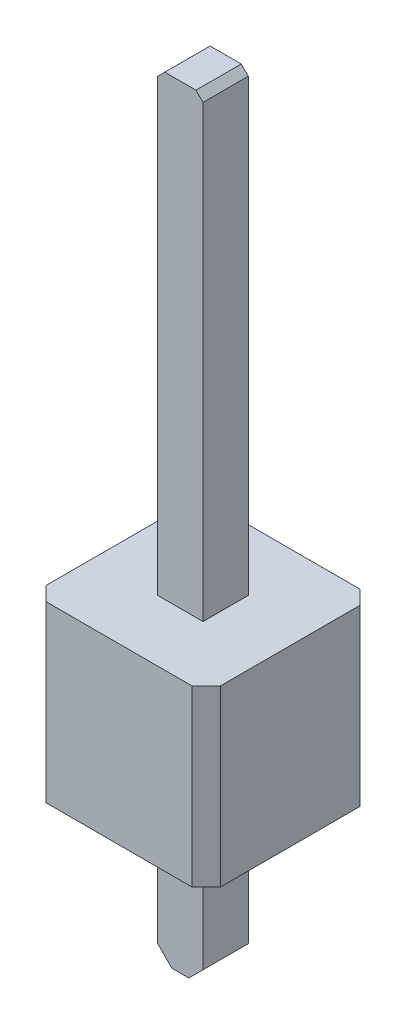
ISO-10303-21;
HEADER;
FILE_DESCRIPTION(('STEP AP214'),'2;1');
FILE_NAME('part.step','',(''),(''),'','','');
FILE_SCHEMA(('AUTOMOTIVE_DESIGN { 1 0 10303 214 1 1 1 1 }'));
ENDSEC;
DATA;
#1=APPLICATION_CONTEXT('core data for automotive mechanical design processes');
#2=APPLICATION_PROTOCOL_DEFINITION('international standard','automotive_design',2000,#1);
#3=PRODUCT_CONTEXT('',#1,'mechanical');
#4=PRODUCT('Part','Part','',(#3));
#5=PRODUCT_RELATED_PRODUCT_CATEGORY('part','',(#4));
#6=PRODUCT_DEFINITION_FORMATION('','',#4);
#7=PRODUCT_DEFINITION_CONTEXT('part definition',#1,'design');
#8=PRODUCT_DEFINITION('design','',#6,#7);
#9=PRODUCT_DEFINITION_SHAPE('','',#8);
#10=(LENGTH_UNIT() NAMED_UNIT(*) SI_UNIT(.MILLI.,.METRE.));
#11=(NAMED_UNIT(*) PLANE_ANGLE_UNIT() SI_UNIT($,.RADIAN.));
#12=(NAMED_UNIT(*) SI_UNIT($,.STERADIAN.) SOLID_ANGLE_UNIT());
#13=UNCERTAINTY_MEASURE_WITH_UNIT(LENGTH_MEASURE(1.E-05),#10,'distance_accuracy_value','');
#14=(GEOMETRIC_REPRESENTATION_CONTEXT(3) GLOBAL_UNCERTAINTY_ASSIGNED_CONTEXT((#13)) GLOBAL_UNIT_ASSIGNED_CONTEXT((#10,
#11,#12)) REPRESENTATION_CONTEXT('',''));
#15=CARTESIAN_POINT('',(0.,0.,0.));
#16=DIRECTION('',(0.,0.,1.));
#17=DIRECTION('',(1.,0.,0.));
#18=AXIS2_PLACEMENT_3D('',#15,#16,#17);
#19=CARTESIAN_POINT('',(-34.7731073021486,-32.8044362792521,2.37));
#20=DIRECTION('',(0.,1.,0.));
#21=DIRECTION('',(0.,0.,1.));
#22=AXIS2_PLACEMENT_3D('',#19,#20,#21);
#23=PLANE('',#22);
#24=DIRECTION('',(0.,0.,-1.));
#25=VECTOR('',#24,1.);
#26=CARTESIAN_POINT('',(-37.2331073021486,-32.8044362792521,2.37));
#27=LINE('',#26,#25);
#28=CARTESIAN_POINT('',(-37.2331073021486,-32.8044362792521,2.17));
#29=VERTEX_POINT('',#28);
#30=CARTESIAN_POINT('',(-37.2331073021486,-32.8044362792521,0.199999999999997));
#31=VERTEX_POINT('',#30);
#32=EDGE_CURVE('E242',#29,#31,#27,.T.);
#33=ORIENTED_EDGE('',*,*,#32,.T.);
#34=DIRECTION('',(-0.707106781186551,0.,0.707106781186544));
#35=VECTOR('',#34,1.);
#36=CARTESIAN_POINT('',(-37.2331073021486,-32.8044362792521,0.199999999999997));
#37=LINE('',#36,#35);
#38=CARTESIAN_POINT('',(-37.0331073021486,-32.8044362792521,0.));
#39=VERTEX_POINT('',#38);
#40=EDGE_CURVE('E277',#31,#39,#37,.F.);
#41=ORIENTED_EDGE('',*,*,#40,.T.);
#42=DIRECTION('',(1.,0.,0.));
#43=VECTOR('',#42,1.);
#44=CARTESIAN_POINT('',(-34.7731073021486,-32.8044362792521,0.));
#45=LINE('',#44,#43);
#46=CARTESIAN_POINT('',(-34.9731073021486,-32.8044362792521,0.));
#47=VERTEX_POINT('',#46);
#48=EDGE_CURVE('E223',#39,#47,#45,.T.);
#49=ORIENTED_EDGE('',*,*,#48,.T.);
#50=DIRECTION('',(-0.707106781186551,0.,-0.707106781186544));
#51=VECTOR('',#50,1.);
#52=CARTESIAN_POINT('',(-34.7731073021486,-32.8044362792521,0.199999999999997));
#53=LINE('',#52,#51);
#54=CARTESIAN_POINT('',(-34.7731073021486,-32.8044362792521,0.199999999999997));
#55=VERTEX_POINT('',#54);
#56=EDGE_CURVE('E272',#47,#55,#53,.F.);
#57=ORIENTED_EDGE('',*,*,#56,.T.);
#58=DIRECTION('',(0.,0.,-1.));
#59=VECTOR('',#58,1.);
#60=CARTESIAN_POINT('',(-34.7731073021486,-32.8044362792521,2.37));
#61=LINE('',#60,#59);
#62=CARTESIAN_POINT('',(-34.7731073021486,-32.8044362792521,2.17));
#63=VERTEX_POINT('',#62);
#64=EDGE_CURVE('E239',#63,#55,#61,.T.);
#65=ORIENTED_EDGE('',*,*,#64,.F.);
#66=DIRECTION('',(-0.707106781186544,0.,0.707106781186551));
#67=VECTOR('',#66,1.);
#68=CARTESIAN_POINT('',(-34.9731073021486,-32.8044362792521,2.37));
#69=LINE('',#68,#67);
#70=CARTESIAN_POINT('',(-34.9731073021486,-32.8044362792521,2.37));
#71=VERTEX_POINT('',#70);
#72=EDGE_CURVE('E262',#63,#71,#69,.T.);
#73=ORIENTED_EDGE('',*,*,#72,.T.);
#74=DIRECTION('',(1.,0.,0.));
#75=VECTOR('',#74,1.);
#76=CARTESIAN_POINT('',(-34.7731073021486,-32.8044362792521,2.37));
#77=LINE('',#76,#75);
#78=CARTESIAN_POINT('',(-37.0331073021486,-32.8044362792521,2.37));
#79=VERTEX_POINT('',#78);
#80=EDGE_CURVE('E224',#79,#71,#77,.T.);
#81=ORIENTED_EDGE('',*,*,#80,.F.);
#82=DIRECTION('',(-0.707106781186544,0.,-0.707106781186551));
#83=VECTOR('',#82,1.);
#84=CARTESIAN_POINT('',(-37.0331073021486,-32.8044362792521,2.37));
#85=LINE('',#84,#83);
#86=EDGE_CURVE('E248',#79,#29,#85,.T.);
#87=ORIENTED_EDGE('',*,*,#86,.T.);
#88=EDGE_LOOP('',(#33,#41,#49,#57,#65,#73,#81,#87));
#89=FACE_BOUND('',#88,.T.);
#90=DIRECTION('',(0.,0.,-1.));
#91=VECTOR('',#90,1.);
#92=CARTESIAN_POINT('',(-36.3231073021486,-32.8044362792521,1.505));
#93=LINE('',#92,#91);
#94=CARTESIAN_POINT('',(-36.3231073021486,-32.8044362792521,1.505));
#95=VERTEX_POINT('',#94);
#96=CARTESIAN_POINT('',(-36.3231073021486,-32.8044362792521,0.865000000000004));
#97=VERTEX_POINT('',#96);
#98=EDGE_CURVE('E168',#95,#97,#93,.T.);
#99=ORIENTED_EDGE('',*,*,#98,.F.);
#100=DIRECTION('',(-1.,0.,0.));
#101=VECTOR('',#100,1.);
#102=CARTESIAN_POINT('',(-35.6831073021486,-32.8044362792521,1.505));
#103=LINE('',#102,#101);
#104=CARTESIAN_POINT('',(-35.6831073021486,-32.8044362792521,1.505));
#105=VERTEX_POINT('',#104);
#106=EDGE_CURVE('E179',#105,#95,#103,.T.);
#107=ORIENTED_EDGE('',*,*,#106,.F.);
#108=DIRECTION('',(0.,0.,1.));
#109=VECTOR('',#108,1.);
#110=CARTESIAN_POINT('',(-35.6831073021486,-32.8044362792521,1.505));
#111=LINE('',#110,#109);
#112=CARTESIAN_POINT('',(-35.6831073021486,-32.8044362792521,0.865000000000004));
#113=VERTEX_POINT('',#112);
#114=EDGE_CURVE('E187',#113,#105,#111,.T.);
#115=ORIENTED_EDGE('',*,*,#114,.F.);
#116=DIRECTION('',(1.,0.,0.));
#117=VECTOR('',#116,1.);
#118=CARTESIAN_POINT('',(-35.6831073021486,-32.8044362792521,0.865000000000004));
#119=LINE('',#118,#117);
#120=EDGE_CURVE('E182',#97,#113,#119,.T.);
#121=ORIENTED_EDGE('',*,*,#120,.F.);
#122=EDGE_LOOP('',(#99,#107,#115,#121));
#123=FACE_BOUND('',#122,.T.);
#124=ADVANCED_FACE('F32',(#89,#123),#23,.F.);
#125=CARTESIAN_POINT('',(-34.7731073021486,-30.3444362792521,2.37));
#126=DIRECTION('',(0.,-1.,0.));
#127=DIRECTION('',(0.,0.,-1.));
#128=AXIS2_PLACEMENT_3D('',#125,#126,#127);
#129=PLANE('',#128);
#130=DIRECTION('',(-1.,0.,0.));
#131=VECTOR('',#130,1.);
#132=CARTESIAN_POINT('',(-34.7731073021486,-30.3444362792521,0.));
#133=LINE('',#132,#131);
#134=CARTESIAN_POINT('',(-34.9731073021486,-30.3444362792521,0.));
#135=VERTEX_POINT('',#134);
#136=CARTESIAN_POINT('',(-37.0331073021486,-30.3444362792521,0.));
#137=VERTEX_POINT('',#136);
#138=EDGE_CURVE('E228',#135,#137,#133,.T.);
#139=ORIENTED_EDGE('',*,*,#138,.T.);
#140=DIRECTION('',(0.707106781186551,0.,-0.707106781186544));
#141=VECTOR('',#140,1.);
#142=CARTESIAN_POINT('',(-37.2331073021486,-30.3444362792521,0.199999999999997));
#143=LINE('',#142,#141);
#144=CARTESIAN_POINT('',(-37.2331073021486,-30.3444362792521,0.199999999999997));
#145=VERTEX_POINT('',#144);
#146=EDGE_CURVE('E281',#137,#145,#143,.F.);
#147=ORIENTED_EDGE('',*,*,#146,.T.);
#148=DIRECTION('',(0.,0.,-1.));
#149=VECTOR('',#148,1.);
#150=CARTESIAN_POINT('',(-37.2331073021486,-30.3444362792521,2.37));
#151=LINE('',#150,#149);
#152=CARTESIAN_POINT('',(-37.2331073021486,-30.3444362792521,2.17));
#153=VERTEX_POINT('',#152);
#154=EDGE_CURVE('E230',#153,#145,#151,.T.);
#155=ORIENTED_EDGE('',*,*,#154,.F.);
#156=DIRECTION('',(0.707106781186544,0.,0.707106781186551));
#157=VECTOR('',#156,1.);
#158=CARTESIAN_POINT('',(-37.0331073021486,-30.3444362792521,2.37));
#159=LINE('',#158,#157);
#160=CARTESIAN_POINT('',(-37.0331073021486,-30.3444362792521,2.37));
#161=VERTEX_POINT('',#160);
#162=EDGE_CURVE('E252',#153,#161,#159,.T.);
#163=ORIENTED_EDGE('',*,*,#162,.T.);
#164=DIRECTION('',(-1.,0.,0.));
#165=VECTOR('',#164,1.);
#166=CARTESIAN_POINT('',(-34.7731073021486,-30.3444362792521,2.37));
#167=LINE('',#166,#165);
#168=CARTESIAN_POINT('',(-34.9731073021486,-30.3444362792521,2.37));
#169=VERTEX_POINT('',#168);
#170=EDGE_CURVE('E227',#169,#161,#167,.T.);
#171=ORIENTED_EDGE('',*,*,#170,.F.);
#172=DIRECTION('',(0.707106781186544,0.,-0.707106781186551));
#173=VECTOR('',#172,1.);
#174=CARTESIAN_POINT('',(-34.9731073021486,-30.3444362792521,2.37));
#175=LINE('',#174,#173);
#176=CARTESIAN_POINT('',(-34.7731073021486,-30.3444362792521,2.17));
#177=VERTEX_POINT('',#176);
#178=EDGE_CURVE('E258',#169,#177,#175,.T.);
#179=ORIENTED_EDGE('',*,*,#178,.T.);
#180=DIRECTION('',(0.,0.,-1.));
#181=VECTOR('',#180,1.);
#182=CARTESIAN_POINT('',(-34.7731073021486,-30.3444362792521,2.37));
#183=LINE('',#182,#181);
#184=CARTESIAN_POINT('',(-34.7731073021486,-30.3444362792521,0.199999999999997));
#185=VERTEX_POINT('',#184);
#186=EDGE_CURVE('E236',#177,#185,#183,.T.);
#187=ORIENTED_EDGE('',*,*,#186,.T.);
#188=DIRECTION('',(0.707106781186551,0.,0.707106781186544));
#189=VECTOR('',#188,1.);
#190=CARTESIAN_POINT('',(-34.7731073021486,-30.3444362792521,0.199999999999997));
#191=LINE('',#190,#189);
#192=EDGE_CURVE('E267',#185,#135,#191,.F.);
#193=ORIENTED_EDGE('',*,*,#192,.T.);
#194=EDGE_LOOP('',(#139,#147,#155,#163,#171,#179,#187,#193));
#195=FACE_BOUND('',#194,.T.);
#196=DIRECTION('',(0.,0.,1.));
#197=VECTOR('',#196,1.);
#198=CARTESIAN_POINT('',(-36.3231073021486,-30.3444362792521,1.505));
#199=LINE('',#198,#197);
#200=CARTESIAN_POINT('',(-36.3231073021486,-30.3444362792521,0.864999999999999));
#201=VERTEX_POINT('',#200);
#202=CARTESIAN_POINT('',(-36.3231073021486,-30.3444362792521,1.505));
#203=VERTEX_POINT('',#202);
#204=EDGE_CURVE('E198',#201,#203,#199,.T.);
#205=ORIENTED_EDGE('',*,*,#204,.F.);
#206=DIRECTION('',(-1.,0.,0.));
#207=VECTOR('',#206,1.);
#208=CARTESIAN_POINT('',(-35.6831073021486,-30.3444362792521,0.864999999999999));
#209=LINE('',#208,#207);
#210=CARTESIAN_POINT('',(-35.6831073021486,-30.3444362792521,0.864999999999999));
#211=VERTEX_POINT('',#210);
#212=EDGE_CURVE('E202',#211,#201,#209,.T.);
#213=ORIENTED_EDGE('',*,*,#212,.F.);
#214=DIRECTION('',(0.,0.,-1.));
#215=VECTOR('',#214,1.);
#216=CARTESIAN_POINT('',(-35.6831073021486,-30.3444362792521,1.505));
#217=LINE('',#216,#215);
#218=CARTESIAN_POINT('',(-35.6831073021486,-30.3444362792521,1.505));
#219=VERTEX_POINT('',#218);
#220=EDGE_CURVE('E211',#219,#211,#217,.T.);
#221=ORIENTED_EDGE('',*,*,#220,.F.);
#222=DIRECTION('',(1.,0.,0.));
#223=VECTOR('',#222,1.);
#224=CARTESIAN_POINT('',(-35.6831073021486,-30.3444362792521,1.505));
#225=LINE('',#224,#223);
#226=EDGE_CURVE('E208',#203,#219,#225,.T.);
#227=ORIENTED_EDGE('',*,*,#226,.F.);
#228=EDGE_LOOP('',(#205,#213,#221,#227));
#229=FACE_BOUND('',#228,.T.);
#230=ADVANCED_FACE('F335',(#195,#229),#129,.F.);
#231=CARTESIAN_POINT('',(-37.2331073021486,-32.8044362792521,2.37));
#232=DIRECTION('',(1.,0.,0.));
#233=DIRECTION('',(0.,0.,-1.));
#234=AXIS2_PLACEMENT_3D('',#231,#232,#233);
#235=PLANE('',#234);
#236=ORIENTED_EDGE('',*,*,#154,.T.);
#237=DIRECTION('',(0.,-1.,0.));
#238=VECTOR('',#237,1.);
#239=CARTESIAN_POINT('',(-37.2331073021486,-32.8044362792521,0.199999999999997));
#240=LINE('',#239,#238);
#241=EDGE_CURVE('E274',#145,#31,#240,.T.);
#242=ORIENTED_EDGE('',*,*,#241,.T.);
#243=ORIENTED_EDGE('',*,*,#32,.F.);
#244=DIRECTION('',(0.,1.,0.));
#245=VECTOR('',#244,1.);
#246=CARTESIAN_POINT('',(-37.2331073021486,-30.3444362792521,2.17));
#247=LINE('',#246,#245);
#248=EDGE_CURVE('E250',#29,#153,#247,.T.);
#249=ORIENTED_EDGE('',*,*,#248,.T.);
#250=EDGE_LOOP('',(#236,#242,#243,#249));
#251=FACE_BOUND('',#250,.T.);
#252=ADVANCED_FACE('F341',(#251),#235,.F.);
#253=CARTESIAN_POINT('',(-34.7731073021486,-32.8044362792521,2.37));
#254=DIRECTION('',(-1.,0.,0.));
#255=DIRECTION('',(0.,0.,1.));
#256=AXIS2_PLACEMENT_3D('',#253,#254,#255);
#257=PLANE('',#256);
#258=ORIENTED_EDGE('',*,*,#64,.T.);
#259=DIRECTION('',(0.,1.,0.));
#260=VECTOR('',#259,1.);
#261=CARTESIAN_POINT('',(-34.7731073021486,-32.8044362792521,0.199999999999997));
#262=LINE('',#261,#260);
#263=EDGE_CURVE('E264',#55,#185,#262,.T.);
#264=ORIENTED_EDGE('',*,*,#263,.T.);
#265=ORIENTED_EDGE('',*,*,#186,.F.);
#266=DIRECTION('',(0.,-1.,0.));
#267=VECTOR('',#266,1.);
#268=CARTESIAN_POINT('',(-34.7731073021486,-32.8044362792521,2.17));
#269=LINE('',#268,#267);
#270=EDGE_CURVE('E260',#177,#63,#269,.T.);
#271=ORIENTED_EDGE('',*,*,#270,.T.);
#272=EDGE_LOOP('',(#258,#264,#265,#271));
#273=FACE_BOUND('',#272,.T.);
#274=ADVANCED_FACE('F346',(#273),#257,.F.);
#275=CARTESIAN_POINT('',(0.,0.,2.37));
#276=DIRECTION('',(0.,0.,1.));
#277=DIRECTION('',(1.,0.,0.));
#278=AXIS2_PLACEMENT_3D('',#275,#276,#277);
#279=PLANE('',#278);
#280=ORIENTED_EDGE('',*,*,#80,.T.);
#281=DIRECTION('',(0.,1.,0.));
#282=VECTOR('',#281,1.);
#283=CARTESIAN_POINT('',(-34.9731073021486,-30.3444362792521,2.37));
#284=LINE('',#283,#282);
#285=EDGE_CURVE('E255',#71,#169,#284,.T.);
#286=ORIENTED_EDGE('',*,*,#285,.T.);
#287=ORIENTED_EDGE('',*,*,#170,.T.);
#288=DIRECTION('',(0.,-1.,0.));
#289=VECTOR('',#288,1.);
#290=CARTESIAN_POINT('',(-37.0331073021486,-32.8044362792521,2.37));
#291=LINE('',#290,#289);
#292=EDGE_CURVE('E245',#161,#79,#291,.T.);
#293=ORIENTED_EDGE('',*,*,#292,.T.);
#294=EDGE_LOOP('',(#280,#286,#287,#293));
#295=FACE_BOUND('',#294,.T.);
#296=ADVANCED_FACE('F409',(#295),#279,.T.);
#297=CARTESIAN_POINT('',(0.,0.,0.));
#298=DIRECTION('',(0.,0.,1.));
#299=DIRECTION('',(1.,0.,0.));
#300=AXIS2_PLACEMENT_3D('',#297,#298,#299);
#301=PLANE('',#300);
#302=ORIENTED_EDGE('',*,*,#48,.F.);
#303=DIRECTION('',(0.,1.,0.));
#304=VECTOR('',#303,1.);
#305=CARTESIAN_POINT('',(-37.0331073021486,0.,0.));
#306=LINE('',#305,#304);
#307=EDGE_CURVE('E279',#39,#137,#306,.T.);
#308=ORIENTED_EDGE('',*,*,#307,.T.);
#309=ORIENTED_EDGE('',*,*,#138,.F.);
#310=DIRECTION('',(0.,-1.,0.));
#311=VECTOR('',#310,1.);
#312=CARTESIAN_POINT('',(-34.9731073021486,0.,0.));
#313=LINE('',#312,#311);
#314=EDGE_CURVE('E269',#135,#47,#313,.T.);
#315=ORIENTED_EDGE('',*,*,#314,.T.);
#316=EDGE_LOOP('',(#302,#308,#309,#315));
#317=FACE_BOUND('',#316,.T.);
#318=ADVANCED_FACE('F402',(#317),#301,.F.);
#319=CARTESIAN_POINT('',(-36.3231073021486,-23.8944362792521,1.505));
#320=DIRECTION('',(1.,0.,0.));
#321=DIRECTION('',(0.,0.,-1.));
#322=AXIS2_PLACEMENT_3D('',#319,#320,#321);
#323=PLANE('',#322);
#324=DIRECTION('',(0.,-1.,0.));
#325=VECTOR('',#324,1.);
#326=CARTESIAN_POINT('',(-36.3231073021486,-23.8944362792521,1.505));
#327=LINE('',#326,#325);
#328=CARTESIAN_POINT('',(-36.3231073021486,-23.9944362792521,1.505));
#329=VERTEX_POINT('',#328);
#330=EDGE_CURVE('E221',#329,#203,#327,.T.);
#331=ORIENTED_EDGE('',*,*,#330,.F.);
#332=DIRECTION('',(0.,0.,-1.));
#333=VECTOR('',#332,1.);
#334=CARTESIAN_POINT('',(-36.3231073021486,-23.9944362792521,0.864999999999999));
#335=LINE('',#334,#333);
#336=CARTESIAN_POINT('',(-36.3231073021486,-23.9944362792521,0.864999999999999));
#337=VERTEX_POINT('',#336);
#338=EDGE_CURVE('E298',#329,#337,#335,.T.);
#339=ORIENTED_EDGE('',*,*,#338,.T.);
#340=DIRECTION('',(0.,-1.,0.));
#341=VECTOR('',#340,1.);
#342=CARTESIAN_POINT('',(-36.3231073021486,-23.8944362792521,0.864999999999999));
#343=LINE('',#342,#341);
#344=EDGE_CURVE('E205',#337,#201,#343,.T.);
#345=ORIENTED_EDGE('',*,*,#344,.T.);
#346=ORIENTED_EDGE('',*,*,#204,.T.);
#347=EDGE_LOOP('',(#331,#339,#345,#346));
#348=FACE_BOUND('',#347,.T.);
#349=ADVANCED_FACE('F400',(#348),#323,.F.);
#350=CARTESIAN_POINT('',(-35.6831073021486,-23.8944362792521,1.505));
#351=DIRECTION('',(0.,0.,-1.));
#352=DIRECTION('',(-1.,0.,0.));
#353=AXIS2_PLACEMENT_3D('',#350,#351,#352);
#354=PLANE('',#353);
#355=DIRECTION('',(1.,0.,0.));
#356=VECTOR('',#355,1.);
#357=CARTESIAN_POINT('',(-35.6831073021486,-23.8944362792521,1.505));
#358=LINE('',#357,#356);
#359=CARTESIAN_POINT('',(-36.2231073021486,-23.8944362792521,1.505));
#360=VERTEX_POINT('',#359);
#361=CARTESIAN_POINT('',(-35.7831073021486,-23.8944362792521,1.505));
#362=VERTEX_POINT('',#361);
#363=EDGE_CURVE('E199',#360,#362,#358,.T.);
#364=ORIENTED_EDGE('',*,*,#363,.F.);
#365=DIRECTION('',(-0.707106781186535,-0.70710678118656,0.));
#366=VECTOR('',#365,1.);
#367=CARTESIAN_POINT('',(-36.2231073021486,-23.8944362792521,1.505));
#368=LINE('',#367,#366);
#369=EDGE_CURVE('E296',#360,#329,#368,.T.);
#370=ORIENTED_EDGE('',*,*,#369,.T.);
#371=ORIENTED_EDGE('',*,*,#330,.T.);
#372=ORIENTED_EDGE('',*,*,#226,.T.);
#373=DIRECTION('',(0.,-1.,0.));
#374=VECTOR('',#373,1.);
#375=CARTESIAN_POINT('',(-35.6831073021486,-23.8944362792521,1.505));
#376=LINE('',#375,#374);
#377=CARTESIAN_POINT('',(-35.6831073021486,-23.9944362792521,1.505));
#378=VERTEX_POINT('',#377);
#379=EDGE_CURVE('E219',#378,#219,#376,.T.);
#380=ORIENTED_EDGE('',*,*,#379,.F.);
#381=DIRECTION('',(-0.707106781186535,0.70710678118656,0.));
#382=VECTOR('',#381,1.);
#383=CARTESIAN_POINT('',(-35.7831073021486,-23.8944362792521,1.505));
#384=LINE('',#383,#382);
#385=EDGE_CURVE('E290',#378,#362,#384,.T.);
#386=ORIENTED_EDGE('',*,*,#385,.T.);
#387=EDGE_LOOP('',(#364,#370,#371,#372,#380,#386));
#388=FACE_BOUND('',#387,.T.);
#389=ADVANCED_FACE('F397',(#388),#354,.F.);
#390=CARTESIAN_POINT('',(-35.6831073021486,-23.8944362792521,1.505));
#391=DIRECTION('',(-1.,0.,0.));
#392=DIRECTION('',(0.,0.,1.));
#393=AXIS2_PLACEMENT_3D('',#390,#391,#392);
#394=PLANE('',#393);
#395=DIRECTION('',(0.,-1.,0.));
#396=VECTOR('',#395,1.);
#397=CARTESIAN_POINT('',(-35.6831073021486,-23.8944362792521,0.864999999999999));
#398=LINE('',#397,#396);
#399=CARTESIAN_POINT('',(-35.6831073021486,-23.9944362792521,0.864999999999999));
#400=VERTEX_POINT('',#399);
#401=EDGE_CURVE('E217',#400,#211,#398,.T.);
#402=ORIENTED_EDGE('',*,*,#401,.F.);
#403=DIRECTION('',(0.,0.,1.));
#404=VECTOR('',#403,1.);
#405=CARTESIAN_POINT('',(-35.6831073021486,-23.9944362792521,1.505));
#406=LINE('',#405,#404);
#407=EDGE_CURVE('E288',#400,#378,#406,.T.);
#408=ORIENTED_EDGE('',*,*,#407,.T.);
#409=ORIENTED_EDGE('',*,*,#379,.T.);
#410=ORIENTED_EDGE('',*,*,#220,.T.);
#411=EDGE_LOOP('',(#402,#408,#409,#410));
#412=FACE_BOUND('',#411,.T.);
#413=ADVANCED_FACE('F390',(#412),#394,.F.);
#414=CARTESIAN_POINT('',(-35.6831073021486,-23.8944362792521,0.864999999999999));
#415=DIRECTION('',(0.,0.,1.));
#416=DIRECTION('',(1.,0.,0.));
#417=AXIS2_PLACEMENT_3D('',#414,#415,#416);
#418=PLANE('',#417);
#419=ORIENTED_EDGE('',*,*,#344,.F.);
#420=DIRECTION('',(0.707106781186535,0.70710678118656,0.));
#421=VECTOR('',#420,1.);
#422=CARTESIAN_POINT('',(-36.2231073021486,-23.8944362792521,0.864999999999999));
#423=LINE('',#422,#421);
#424=CARTESIAN_POINT('',(-36.2231073021486,-23.8944362792521,0.864999999999999));
#425=VERTEX_POINT('',#424);
#426=EDGE_CURVE('E300',#337,#425,#423,.T.);
#427=ORIENTED_EDGE('',*,*,#426,.T.);
#428=DIRECTION('',(-1.,0.,0.));
#429=VECTOR('',#428,1.);
#430=CARTESIAN_POINT('',(-35.6831073021486,-23.8944362792521,0.864999999999999));
#431=LINE('',#430,#429);
#432=CARTESIAN_POINT('',(-35.7831073021486,-23.8944362792521,0.864999999999999));
#433=VERTEX_POINT('',#432);
#434=EDGE_CURVE('E201',#433,#425,#431,.T.);
#435=ORIENTED_EDGE('',*,*,#434,.F.);
#436=DIRECTION('',(0.707106781186535,-0.70710678118656,0.));
#437=VECTOR('',#436,1.);
#438=CARTESIAN_POINT('',(-35.7831073021486,-23.8944362792521,0.864999999999999));
#439=LINE('',#438,#437);
#440=EDGE_CURVE('E286',#433,#400,#439,.T.);
#441=ORIENTED_EDGE('',*,*,#440,.T.);
#442=ORIENTED_EDGE('',*,*,#401,.T.);
#443=ORIENTED_EDGE('',*,*,#212,.T.);
#444=EDGE_LOOP('',(#419,#427,#435,#441,#442,#443));
#445=FACE_BOUND('',#444,.T.);
#446=ADVANCED_FACE('F380',(#445),#418,.F.);
#447=CARTESIAN_POINT('',(0.,-23.8944362792521,0.));
#448=DIRECTION('',(0.,1.,0.));
#449=DIRECTION('',(0.,0.,1.));
#450=AXIS2_PLACEMENT_3D('',#447,#448,#449);
#451=PLANE('',#450);
#452=ORIENTED_EDGE('',*,*,#434,.T.);
#453=DIRECTION('',(0.,0.,1.));
#454=VECTOR('',#453,1.);
#455=CARTESIAN_POINT('',(-36.2231073021486,-23.8944362792521,1.505));
#456=LINE('',#455,#454);
#457=EDGE_CURVE('E293',#425,#360,#456,.T.);
#458=ORIENTED_EDGE('',*,*,#457,.T.);
#459=ORIENTED_EDGE('',*,*,#363,.T.);
#460=DIRECTION('',(0.,0.,-1.));
#461=VECTOR('',#460,1.);
#462=CARTESIAN_POINT('',(-35.7831073021486,-23.8944362792521,0.864999999999999));
#463=LINE('',#462,#461);
#464=EDGE_CURVE('E283',#362,#433,#463,.T.);
#465=ORIENTED_EDGE('',*,*,#464,.T.);
#466=EDGE_LOOP('',(#452,#458,#459,#465));
#467=FACE_BOUND('',#466,.T.);
#468=ADVANCED_FACE('F382',(#467),#451,.T.);
#469=CARTESIAN_POINT('',(-36.3231073021486,-34.8044362792521,1.505));
#470=DIRECTION('',(1.,0.,0.));
#471=DIRECTION('',(0.,0.,-1.));
#472=AXIS2_PLACEMENT_3D('',#469,#470,#471);
#473=PLANE('',#472);
#474=DIRECTION('',(0.,1.,0.));
#475=VECTOR('',#474,1.);
#476=CARTESIAN_POINT('',(-36.3231073021486,-34.8044362792521,0.865000000000004));
#477=LINE('',#476,#475);
#478=CARTESIAN_POINT('',(-36.3231073021486,-34.6044362792521,0.865000000000004));
#479=VERTEX_POINT('',#478);
#480=EDGE_CURVE('E196',#479,#97,#477,.T.);
#481=ORIENTED_EDGE('',*,*,#480,.F.);
#482=DIRECTION('',(0.,0.,1.));
#483=VECTOR('',#482,1.);
#484=CARTESIAN_POINT('',(-36.3231073021486,-34.6044362792521,1.505));
#485=LINE('',#484,#483);
#486=CARTESIAN_POINT('',(-36.3231073021486,-34.6044362792521,1.505));
#487=VERTEX_POINT('',#486);
#488=EDGE_CURVE('E40',#479,#487,#485,.T.);
#489=ORIENTED_EDGE('',*,*,#488,.T.);
#490=DIRECTION('',(0.,1.,0.));
#491=VECTOR('',#490,1.);
#492=CARTESIAN_POINT('',(-36.3231073021486,-34.8044362792521,1.505));
#493=LINE('',#492,#491);
#494=EDGE_CURVE('E165',#487,#95,#493,.T.);
#495=ORIENTED_EDGE('',*,*,#494,.T.);
#496=ORIENTED_EDGE('',*,*,#98,.T.);
#497=EDGE_LOOP('',(#481,#489,#495,#496));
#498=FACE_BOUND('',#497,.T.);
#499=ADVANCED_FACE('F167',(#498),#473,.F.);
#500=CARTESIAN_POINT('',(-35.6831073021486,-34.8044362792521,0.865000000000004));
#501=DIRECTION('',(0.,0.,1.));
#502=DIRECTION('',(1.,0.,0.));
#503=AXIS2_PLACEMENT_3D('',#500,#501,#502);
#504=PLANE('',#503);
#505=DIRECTION('',(1.,0.,0.));
#506=VECTOR('',#505,1.);
#507=CARTESIAN_POINT('',(-35.6831073021486,-34.8044362792521,0.865000000000004));
#508=LINE('',#507,#506);
#509=CARTESIAN_POINT('',(-36.1231073021486,-34.8044362792521,0.865000000000004));
#510=VERTEX_POINT('',#509);
#511=CARTESIAN_POINT('',(-35.8831073021486,-34.8044362792521,0.865000000000004));
#512=VERTEX_POINT('',#511);
#513=EDGE_CURVE('E186',#510,#512,#508,.T.);
#514=ORIENTED_EDGE('',*,*,#513,.F.);
#515=DIRECTION('',(0.707106781186548,-0.707106781186548,0.));
#516=VECTOR('',#515,1.);
#517=CARTESIAN_POINT('',(-36.1231073021486,-34.8044362792521,0.865000000000004));
#518=LINE('',#517,#516);
#519=EDGE_CURVE('E54',#510,#479,#518,.F.);
#520=ORIENTED_EDGE('',*,*,#519,.T.);
#521=ORIENTED_EDGE('',*,*,#480,.T.);
#522=ORIENTED_EDGE('',*,*,#120,.T.);
#523=DIRECTION('',(0.,1.,0.));
#524=VECTOR('',#523,1.);
#525=CARTESIAN_POINT('',(-35.6831073021486,-34.8044362792521,0.865000000000004));
#526=LINE('',#525,#524);
#527=CARTESIAN_POINT('',(-35.6831073021486,-34.6044362792521,0.865000000000004));
#528=VERTEX_POINT('',#527);
#529=EDGE_CURVE('E194',#528,#113,#526,.T.);
#530=ORIENTED_EDGE('',*,*,#529,.F.);
#531=DIRECTION('',(0.707106781186548,0.707106781186548,0.));
#532=VECTOR('',#531,1.);
#533=CARTESIAN_POINT('',(-35.8831073021486,-34.8044362792521,0.865000000000004));
#534=LINE('',#533,#532);
#535=EDGE_CURVE('E309',#528,#512,#534,.F.);
#536=ORIENTED_EDGE('',*,*,#535,.T.);
#537=EDGE_LOOP('',(#514,#520,#521,#522,#530,#536));
#538=FACE_BOUND('',#537,.T.);
#539=ADVANCED_FACE('F321',(#538),#504,.F.);
#540=CARTESIAN_POINT('',(-35.6831073021486,-34.8044362792521,1.505));
#541=DIRECTION('',(-1.,0.,0.));
#542=DIRECTION('',(0.,0.,1.));
#543=AXIS2_PLACEMENT_3D('',#540,#541,#542);
#544=PLANE('',#543);
#545=DIRECTION('',(0.,1.,0.));
#546=VECTOR('',#545,1.);
#547=CARTESIAN_POINT('',(-35.6831073021486,-34.8044362792521,1.505));
#548=LINE('',#547,#546);
#549=CARTESIAN_POINT('',(-35.6831073021486,-34.6044362792521,1.505));
#550=VERTEX_POINT('',#549);
#551=EDGE_CURVE('E172',#550,#105,#548,.T.);
#552=ORIENTED_EDGE('',*,*,#551,.F.);
#553=DIRECTION('',(0.,0.,-1.));
#554=VECTOR('',#553,1.);
#555=CARTESIAN_POINT('',(-35.6831073021486,-34.6044362792521,1.505));
#556=LINE('',#555,#554);
#557=EDGE_CURVE('E307',#550,#528,#556,.T.);
#558=ORIENTED_EDGE('',*,*,#557,.T.);
#559=ORIENTED_EDGE('',*,*,#529,.T.);
#560=ORIENTED_EDGE('',*,*,#114,.T.);
#561=EDGE_LOOP('',(#552,#558,#559,#560));
#562=FACE_BOUND('',#561,.T.);
#563=ADVANCED_FACE('F517',(#562),#544,.F.);
#564=CARTESIAN_POINT('',(-35.6831073021486,-34.8044362792521,1.505));
#565=DIRECTION('',(0.,0.,-1.));
#566=DIRECTION('',(-1.,0.,0.));
#567=AXIS2_PLACEMENT_3D('',#564,#565,#566);
#568=PLANE('',#567);
#569=ORIENTED_EDGE('',*,*,#494,.F.);
#570=DIRECTION('',(-0.707106781186548,0.707106781186548,0.));
#571=VECTOR('',#570,1.);
#572=CARTESIAN_POINT('',(-36.1231073021486,-34.8044362792521,1.505));
#573=LINE('',#572,#571);
#574=CARTESIAN_POINT('',(-36.1231073021486,-34.8044362792521,1.505));
#575=VERTEX_POINT('',#574);
#576=EDGE_CURVE('E11',#487,#575,#573,.F.);
#577=ORIENTED_EDGE('',*,*,#576,.T.);
#578=DIRECTION('',(-1.,0.,0.));
#579=VECTOR('',#578,1.);
#580=CARTESIAN_POINT('',(-35.6831073021486,-34.8044362792521,1.505));
#581=LINE('',#580,#579);
#582=CARTESIAN_POINT('',(-35.8831073021486,-34.8044362792521,1.505));
#583=VERTEX_POINT('',#582);
#584=EDGE_CURVE('E173',#583,#575,#581,.T.);
#585=ORIENTED_EDGE('',*,*,#584,.F.);
#586=DIRECTION('',(-0.707106781186548,-0.707106781186548,0.));
#587=VECTOR('',#586,1.);
#588=CARTESIAN_POINT('',(-35.8831073021486,-34.8044362792521,1.505));
#589=LINE('',#588,#587);
#590=EDGE_CURVE('E305',#583,#550,#589,.F.);
#591=ORIENTED_EDGE('',*,*,#590,.T.);
#592=ORIENTED_EDGE('',*,*,#551,.T.);
#593=ORIENTED_EDGE('',*,*,#106,.T.);
#594=EDGE_LOOP('',(#569,#577,#585,#591,#592,#593));
#595=FACE_BOUND('',#594,.T.);
#596=ADVANCED_FACE('F184',(#595),#568,.F.);
#597=CARTESIAN_POINT('',(0.,-34.8044362792521,0.));
#598=DIRECTION('',(0.,1.,0.));
#599=DIRECTION('',(0.,0.,1.));
#600=AXIS2_PLACEMENT_3D('',#597,#598,#599);
#601=PLANE('',#600);
#602=ORIENTED_EDGE('',*,*,#584,.T.);
#603=DIRECTION('',(0.,0.,-1.));
#604=VECTOR('',#603,1.);
#605=CARTESIAN_POINT('',(-36.1231073021486,-34.8044362792521,0.));
#606=LINE('',#605,#604);
#607=EDGE_CURVE('E312',#575,#510,#606,.T.);
#608=ORIENTED_EDGE('',*,*,#607,.T.);
#609=ORIENTED_EDGE('',*,*,#513,.T.);
#610=DIRECTION('',(0.,0.,1.));
#611=VECTOR('',#610,1.);
#612=CARTESIAN_POINT('',(-35.8831073021486,-34.8044362792521,0.));
#613=LINE('',#612,#611);
#614=EDGE_CURVE('E302',#512,#583,#613,.T.);
#615=ORIENTED_EDGE('',*,*,#614,.T.);
#616=EDGE_LOOP('',(#602,#608,#609,#615));
#617=FACE_BOUND('',#616,.T.);
#618=ADVANCED_FACE('F318',(#617),#601,.F.);
#619=CARTESIAN_POINT('',(-37.0331073021486,0.,2.37));
#620=DIRECTION('',(-0.707106781186551,0.,0.707106781186544));
#621=DIRECTION('',(0.,1.,0.));
#622=AXIS2_PLACEMENT_3D('',#619,#620,#621);
#623=PLANE('',#622);
#624=ORIENTED_EDGE('',*,*,#162,.F.);
#625=ORIENTED_EDGE('',*,*,#248,.F.);
#626=ORIENTED_EDGE('',*,*,#86,.F.);
#627=ORIENTED_EDGE('',*,*,#292,.F.);
#628=EDGE_LOOP('',(#624,#625,#626,#627));
#629=FACE_BOUND('',#628,.T.);
#630=ADVANCED_FACE('F350',(#629),#623,.T.);
#631=CARTESIAN_POINT('',(-34.9731073021486,0.,2.37));
#632=DIRECTION('',(0.707106781186551,0.,0.707106781186544));
#633=DIRECTION('',(0.,-1.,0.));
#634=AXIS2_PLACEMENT_3D('',#631,#632,#633);
#635=PLANE('',#634);
#636=ORIENTED_EDGE('',*,*,#72,.F.);
#637=ORIENTED_EDGE('',*,*,#270,.F.);
#638=ORIENTED_EDGE('',*,*,#178,.F.);
#639=ORIENTED_EDGE('',*,*,#285,.F.);
#640=EDGE_LOOP('',(#636,#637,#638,#639));
#641=FACE_BOUND('',#640,.T.);
#642=ADVANCED_FACE('F353',(#641),#635,.T.);
#643=CARTESIAN_POINT('',(-34.7731073021486,-32.8044362792521,0.199999999999997));
#644=DIRECTION('',(-0.707106781186544,0.,0.707106781186551));
#645=DIRECTION('',(0.,1.,0.));
#646=AXIS2_PLACEMENT_3D('',#643,#644,#645);
#647=PLANE('',#646);
#648=ORIENTED_EDGE('',*,*,#56,.F.);
#649=ORIENTED_EDGE('',*,*,#314,.F.);
#650=ORIENTED_EDGE('',*,*,#192,.F.);
#651=ORIENTED_EDGE('',*,*,#263,.F.);
#652=EDGE_LOOP('',(#648,#649,#650,#651));
#653=FACE_BOUND('',#652,.T.);
#654=ADVANCED_FACE('F357',(#653),#647,.F.);
#655=CARTESIAN_POINT('',(-37.2331073021486,-32.8044362792521,0.199999999999997));
#656=DIRECTION('',(0.707106781186544,0.,0.707106781186551));
#657=DIRECTION('',(0.,-1.,0.));
#658=AXIS2_PLACEMENT_3D('',#655,#656,#657);
#659=PLANE('',#658);
#660=ORIENTED_EDGE('',*,*,#146,.F.);
#661=ORIENTED_EDGE('',*,*,#307,.F.);
#662=ORIENTED_EDGE('',*,*,#40,.F.);
#663=ORIENTED_EDGE('',*,*,#241,.F.);
#664=EDGE_LOOP('',(#660,#661,#662,#663));
#665=FACE_BOUND('',#664,.T.);
#666=ADVANCED_FACE('F361',(#665),#659,.F.);
#667=CARTESIAN_POINT('',(-35.7831073021486,-23.8944362792521,0.));
#668=DIRECTION('',(0.70710678118656,0.707106781186535,0.));
#669=DIRECTION('',(0.,0.,1.));
#670=AXIS2_PLACEMENT_3D('',#667,#668,#669);
#671=PLANE('',#670);
#672=ORIENTED_EDGE('',*,*,#385,.F.);
#673=ORIENTED_EDGE('',*,*,#407,.F.);
#674=ORIENTED_EDGE('',*,*,#440,.F.);
#675=ORIENTED_EDGE('',*,*,#464,.F.);
#676=EDGE_LOOP('',(#672,#673,#674,#675));
#677=FACE_BOUND('',#676,.T.);
#678=ADVANCED_FACE('F365',(#677),#671,.T.);
#679=CARTESIAN_POINT('',(-36.2231073021486,-23.8944362792521,0.));
#680=DIRECTION('',(-0.70710678118656,0.707106781186535,0.));
#681=DIRECTION('',(0.,0.,-1.));
#682=AXIS2_PLACEMENT_3D('',#679,#680,#681);
#683=PLANE('',#682);
#684=ORIENTED_EDGE('',*,*,#426,.F.);
#685=ORIENTED_EDGE('',*,*,#338,.F.);
#686=ORIENTED_EDGE('',*,*,#369,.F.);
#687=ORIENTED_EDGE('',*,*,#457,.F.);
#688=EDGE_LOOP('',(#684,#685,#686,#687));
#689=FACE_BOUND('',#688,.T.);
#690=ADVANCED_FACE('F333',(#689),#683,.T.);
#691=CARTESIAN_POINT('',(-35.8831073021486,-34.8044362792521,0.));
#692=DIRECTION('',(-0.707106781186548,0.707106781186548,0.));
#693=DIRECTION('',(0.,0.,1.));
#694=AXIS2_PLACEMENT_3D('',#691,#692,#693);
#695=PLANE('',#694);
#696=ORIENTED_EDGE('',*,*,#535,.F.);
#697=ORIENTED_EDGE('',*,*,#557,.F.);
#698=ORIENTED_EDGE('',*,*,#590,.F.);
#699=ORIENTED_EDGE('',*,*,#614,.F.);
#700=EDGE_LOOP('',(#696,#697,#698,#699));
#701=FACE_BOUND('',#700,.T.);
#702=ADVANCED_FACE('F327',(#701),#695,.F.);
#703=CARTESIAN_POINT('',(-36.1231073021486,-34.8044362792521,0.));
#704=DIRECTION('',(0.707106781186548,0.707106781186548,0.));
#705=DIRECTION('',(0.,0.,-1.));
#706=AXIS2_PLACEMENT_3D('',#703,#704,#705);
#707=PLANE('',#706);
#708=ORIENTED_EDGE('',*,*,#576,.F.);
#709=ORIENTED_EDGE('',*,*,#488,.F.);
#710=ORIENTED_EDGE('',*,*,#519,.F.);
#711=ORIENTED_EDGE('',*,*,#607,.F.);
#712=EDGE_LOOP('',(#708,#709,#710,#711));
#713=FACE_BOUND('',#712,.T.);
#714=ADVANCED_FACE('F34',(#713),#707,.F.);
#715=CLOSED_SHELL('',(#124,#230,#252,#274,#296,#318,#349,#389,#413,#446,#468,#499,#539,#563,
#596,#618,#630,#642,#654,#666,#678,#690,#702,#714));
#716=MANIFOLD_SOLID_BREP('B2',#715);
#717=ADVANCED_BREP_SHAPE_REPRESENTATION('',(#18,#716),#14);
#718=SHAPE_DEFINITION_REPRESENTATION(#9,#717);
ENDSEC;
END-ISO-10303-21;
